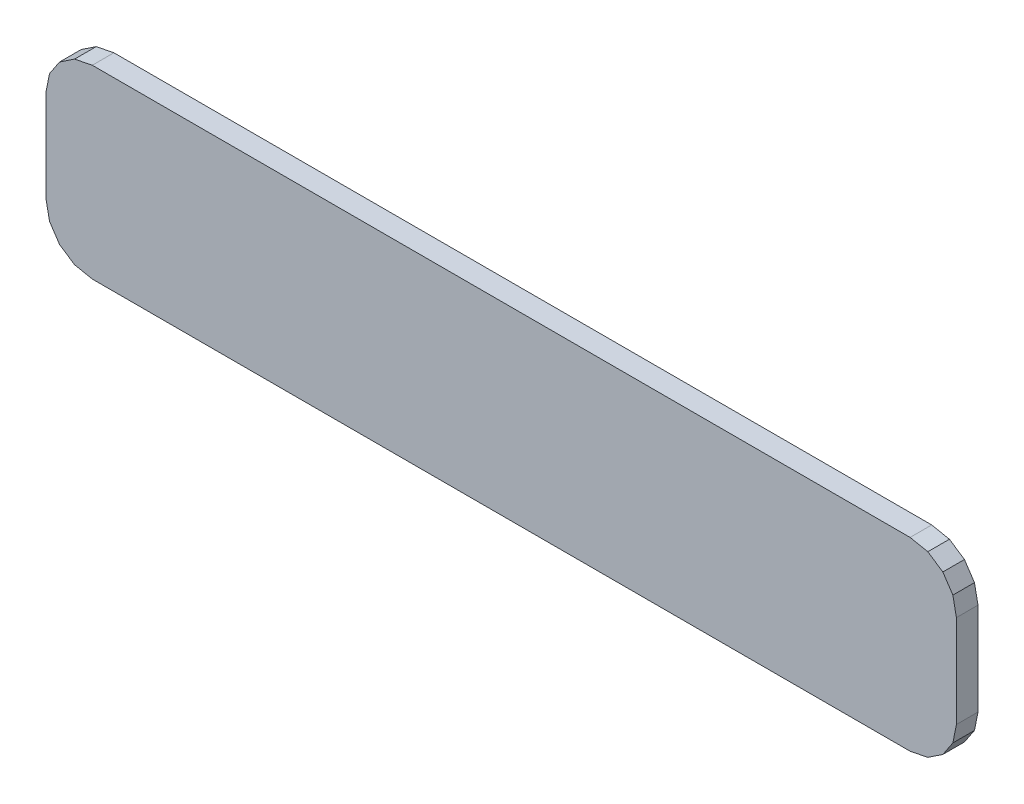
ISO-10303-21;
HEADER;
FILE_DESCRIPTION(('STEP AP214'),'2;1');
FILE_NAME('part.step','',(''),(''),'','','');
FILE_SCHEMA(('AUTOMOTIVE_DESIGN { 1 0 10303 214 1 1 1 1 }'));
ENDSEC;
DATA;
#1=APPLICATION_CONTEXT('core data for automotive mechanical design processes');
#2=APPLICATION_PROTOCOL_DEFINITION('international standard','automotive_design',2000,#1);
#3=PRODUCT_CONTEXT('',#1,'mechanical');
#4=PRODUCT('Part','Part','',(#3));
#5=PRODUCT_RELATED_PRODUCT_CATEGORY('part','',(#4));
#6=PRODUCT_DEFINITION_FORMATION('','',#4);
#7=PRODUCT_DEFINITION_CONTEXT('part definition',#1,'design');
#8=PRODUCT_DEFINITION('design','',#6,#7);
#9=PRODUCT_DEFINITION_SHAPE('','',#8);
#10=(LENGTH_UNIT() NAMED_UNIT(*) SI_UNIT(.MILLI.,.METRE.));
#11=(NAMED_UNIT(*) PLANE_ANGLE_UNIT() SI_UNIT($,.RADIAN.));
#12=(NAMED_UNIT(*) SI_UNIT($,.STERADIAN.) SOLID_ANGLE_UNIT());
#13=UNCERTAINTY_MEASURE_WITH_UNIT(LENGTH_MEASURE(1.E-05),#10,'distance_accuracy_value','');
#14=(GEOMETRIC_REPRESENTATION_CONTEXT(3) GLOBAL_UNCERTAINTY_ASSIGNED_CONTEXT((#13)) GLOBAL_UNIT_ASSIGNED_CONTEXT((#10,
#11,#12)) REPRESENTATION_CONTEXT('',''));
#15=CARTESIAN_POINT('',(0.,0.,0.));
#16=DIRECTION('',(0.,0.,1.));
#17=DIRECTION('',(1.,0.,0.));
#18=AXIS2_PLACEMENT_3D('',#15,#16,#17);
#19=CARTESIAN_POINT('',(131.4125,-68.,1.635));
#20=DIRECTION('',(0.,0.,-1.));
#21=DIRECTION('',(0.,-1.,0.));
#22=AXIS2_PLACEMENT_3D('',#19,#20,#21);
#23=PLANE('',#22);
#24=DIRECTION('',(0.98078517484451,-0.195090852694903,0.));
#25=VECTOR('',#24,1.);
#26=CARTESIAN_POINT('',(132.075,-67.85,1.635));
#27=LINE('',#26,#25);
#28=CARTESIAN_POINT('',(132.075,-67.85,1.635));
#29=VERTEX_POINT('',#28);
#30=CARTESIAN_POINT('',(132.103701,-67.855709,1.635));
#31=VERTEX_POINT('',#30);
#32=EDGE_CURVE('E25',#29,#31,#27,.T.);
#33=ORIENTED_EDGE('',*,*,#32,.F.);
#34=DIRECTION('',(1.,0.,0.));
#35=VECTOR('',#34,1.);
#36=CARTESIAN_POINT('',(130.75,-67.85,1.635));
#37=LINE('',#36,#35);
#38=CARTESIAN_POINT('',(130.75,-67.85,1.635));
#39=VERTEX_POINT('',#38);
#40=EDGE_CURVE('E389',#39,#29,#37,.T.);
#41=ORIENTED_EDGE('',*,*,#40,.F.);
#42=DIRECTION('',(0.98078517484451,0.195090852694903,0.));
#43=VECTOR('',#42,1.);
#44=CARTESIAN_POINT('',(130.721299,-67.855709,1.635));
#45=LINE('',#44,#43);
#46=CARTESIAN_POINT('',(130.721299,-67.855709,1.635));
#47=VERTEX_POINT('',#46);
#48=EDGE_CURVE('E231',#47,#39,#45,.T.);
#49=ORIENTED_EDGE('',*,*,#48,.F.);
#50=DIRECTION('',(0.831471547866119,0.55556733623308,0.));
#51=VECTOR('',#50,1.);
#52=CARTESIAN_POINT('',(130.696967,-67.871967,1.635));
#53=LINE('',#52,#51);
#54=CARTESIAN_POINT('',(130.696967,-67.871967,1.635));
#55=VERTEX_POINT('',#54);
#56=EDGE_CURVE('E277',#55,#47,#53,.T.);
#57=ORIENTED_EDGE('',*,*,#56,.F.);
#58=DIRECTION('',(0.555567336231926,0.83147154786689,0.));
#59=VECTOR('',#58,1.);
#60=CARTESIAN_POINT('',(130.680709,-67.896299,1.635));
#61=LINE('',#60,#59);
#62=CARTESIAN_POINT('',(130.680709,-67.896299,1.635));
#63=VERTEX_POINT('',#62);
#64=EDGE_CURVE('E413',#63,#55,#61,.T.);
#65=ORIENTED_EDGE('',*,*,#64,.F.);
#66=DIRECTION('',(0.19509085269394,0.980785174844701,0.));
#67=VECTOR('',#66,1.);
#68=CARTESIAN_POINT('',(130.675,-67.925,1.635));
#69=LINE('',#68,#67);
#70=CARTESIAN_POINT('',(130.675,-67.925,1.635));
#71=VERTEX_POINT('',#70);
#72=EDGE_CURVE('E401',#71,#63,#69,.T.);
#73=ORIENTED_EDGE('',*,*,#72,.F.);
#74=DIRECTION('',(0.,1.,0.));
#75=VECTOR('',#74,1.);
#76=CARTESIAN_POINT('',(130.675,-68.075,1.635));
#77=LINE('',#76,#75);
#78=CARTESIAN_POINT('',(130.675,-68.075,1.635));
#79=VERTEX_POINT('',#78);
#80=EDGE_CURVE('E309',#79,#71,#77,.T.);
#81=ORIENTED_EDGE('',*,*,#80,.F.);
#82=DIRECTION('',(-0.19509085269394,0.980785174844701,0.));
#83=VECTOR('',#82,1.);
#84=CARTESIAN_POINT('',(130.680709,-68.103701,1.635));
#85=LINE('',#84,#83);
#86=CARTESIAN_POINT('',(130.680709,-68.103701,1.635));
#87=VERTEX_POINT('',#86);
#88=EDGE_CURVE('E257',#87,#79,#85,.T.);
#89=ORIENTED_EDGE('',*,*,#88,.F.);
#90=DIRECTION('',(-0.555567336231926,0.83147154786689,0.));
#91=VECTOR('',#90,1.);
#92=CARTESIAN_POINT('',(130.696967,-68.128033,1.635));
#93=LINE('',#92,#91);
#94=CARTESIAN_POINT('',(130.696967,-68.128033,1.635));
#95=VERTEX_POINT('',#94);
#96=EDGE_CURVE('E326',#95,#87,#93,.T.);
#97=ORIENTED_EDGE('',*,*,#96,.F.);
#98=DIRECTION('',(-0.831471547866119,0.55556733623308,0.));
#99=VECTOR('',#98,1.);
#100=CARTESIAN_POINT('',(130.721299,-68.144291,1.635));
#101=LINE('',#100,#99);
#102=CARTESIAN_POINT('',(130.721299,-68.144291,1.635));
#103=VERTEX_POINT('',#102);
#104=EDGE_CURVE('E361',#103,#95,#101,.T.);
#105=ORIENTED_EDGE('',*,*,#104,.F.);
#106=DIRECTION('',(-0.98078517484451,0.195090852694903,0.));
#107=VECTOR('',#106,1.);
#108=CARTESIAN_POINT('',(130.75,-68.15,1.635));
#109=LINE('',#108,#107);
#110=CARTESIAN_POINT('',(130.75,-68.15,1.635));
#111=VERTEX_POINT('',#110);
#112=EDGE_CURVE('E349',#111,#103,#109,.T.);
#113=ORIENTED_EDGE('',*,*,#112,.F.);
#114=DIRECTION('',(-1.,0.,0.));
#115=VECTOR('',#114,1.);
#116=CARTESIAN_POINT('',(132.075,-68.15,1.635));
#117=LINE('',#116,#115);
#118=CARTESIAN_POINT('',(132.075,-68.15,1.635));
#119=VERTEX_POINT('',#118);
#120=EDGE_CURVE('E296',#119,#111,#117,.T.);
#121=ORIENTED_EDGE('',*,*,#120,.F.);
#122=DIRECTION('',(-0.98078517484451,-0.195090852694903,0.));
#123=VECTOR('',#122,1.);
#124=CARTESIAN_POINT('',(132.103701,-68.144291,1.635));
#125=LINE('',#124,#123);
#126=CARTESIAN_POINT('',(132.103701,-68.144291,1.635));
#127=VERTEX_POINT('',#126);
#128=EDGE_CURVE('E331',#127,#119,#125,.T.);
#129=ORIENTED_EDGE('',*,*,#128,.F.);
#130=DIRECTION('',(-0.831471547866119,-0.55556733623308,0.));
#131=VECTOR('',#130,1.);
#132=CARTESIAN_POINT('',(132.128033,-68.128033,1.635));
#133=LINE('',#132,#131);
#134=CARTESIAN_POINT('',(132.128033,-68.128033,1.635));
#135=VERTEX_POINT('',#134);
#136=EDGE_CURVE('E313',#135,#127,#133,.T.);
#137=ORIENTED_EDGE('',*,*,#136,.F.);
#138=DIRECTION('',(-0.55556733623308,-0.831471547866119,0.));
#139=VECTOR('',#138,1.);
#140=CARTESIAN_POINT('',(132.144291,-68.103701,1.635));
#141=LINE('',#140,#139);
#142=CARTESIAN_POINT('',(132.144291,-68.103701,1.635));
#143=VERTEX_POINT('',#142);
#144=EDGE_CURVE('E237',#143,#135,#141,.T.);
#145=ORIENTED_EDGE('',*,*,#144,.F.);
#146=DIRECTION('',(-0.19509085269394,-0.980785174844701,0.));
#147=VECTOR('',#146,1.);
#148=CARTESIAN_POINT('',(132.15,-68.075,1.635));
#149=LINE('',#148,#147);
#150=CARTESIAN_POINT('',(132.15,-68.075,1.635));
#151=VERTEX_POINT('',#150);
#152=EDGE_CURVE('E238',#151,#143,#149,.T.);
#153=ORIENTED_EDGE('',*,*,#152,.F.);
#154=DIRECTION('',(0.,-1.,0.));
#155=VECTOR('',#154,1.);
#156=CARTESIAN_POINT('',(132.15,-67.925,1.635));
#157=LINE('',#156,#155);
#158=CARTESIAN_POINT('',(132.15,-67.925,1.635));
#159=VERTEX_POINT('',#158);
#160=EDGE_CURVE('E252',#159,#151,#157,.T.);
#161=ORIENTED_EDGE('',*,*,#160,.F.);
#162=DIRECTION('',(0.19509085269394,-0.980785174844701,0.));
#163=VECTOR('',#162,1.);
#164=CARTESIAN_POINT('',(132.144291,-67.896299,1.635));
#165=LINE('',#164,#163);
#166=CARTESIAN_POINT('',(132.144291,-67.896299,1.635));
#167=VERTEX_POINT('',#166);
#168=EDGE_CURVE('E266',#167,#159,#165,.T.);
#169=ORIENTED_EDGE('',*,*,#168,.F.);
#170=DIRECTION('',(0.55556733623308,-0.831471547866119,0.));
#171=VECTOR('',#170,1.);
#172=CARTESIAN_POINT('',(132.128033,-67.871967,1.635));
#173=LINE('',#172,#171);
#174=CARTESIAN_POINT('',(132.128033,-67.871967,1.635));
#175=VERTEX_POINT('',#174);
#176=EDGE_CURVE('E206',#175,#167,#173,.T.);
#177=ORIENTED_EDGE('',*,*,#176,.F.);
#178=DIRECTION('',(0.831471547866119,-0.55556733623308,0.));
#179=VECTOR('',#178,1.);
#180=CARTESIAN_POINT('',(132.103701,-67.855709,1.635));
#181=LINE('',#180,#179);
#182=EDGE_CURVE('E204',#31,#175,#181,.T.);
#183=ORIENTED_EDGE('',*,*,#182,.F.);
#184=EDGE_LOOP('',(#33,#41,#49,#57,#65,#73,#81,#89,#97,#105,#113,#121,#129,#137,#145,#153,#161,
#169,#177,#183));
#185=FACE_BOUND('',#184,.T.);
#186=ADVANCED_FACE('F17',(#185),#23,.F.);
#187=CARTESIAN_POINT('',(131.4125,-68.,1.6));
#188=DIRECTION('',(0.,0.,-1.));
#189=DIRECTION('',(0.,-1.,0.));
#190=AXIS2_PLACEMENT_3D('',#187,#188,#189);
#191=PLANE('',#190);
#192=DIRECTION('',(0.831471547866119,-0.55556733623308,0.));
#193=VECTOR('',#192,1.);
#194=CARTESIAN_POINT('',(132.103701,-67.855709,1.6));
#195=LINE('',#194,#193);
#196=CARTESIAN_POINT('',(132.103701,-67.855709,1.6));
#197=VERTEX_POINT('',#196);
#198=CARTESIAN_POINT('',(132.128033,-67.871967,1.6));
#199=VERTEX_POINT('',#198);
#200=EDGE_CURVE('E216',#197,#199,#195,.T.);
#201=ORIENTED_EDGE('',*,*,#200,.T.);
#202=DIRECTION('',(0.55556733623308,-0.831471547866119,0.));
#203=VECTOR('',#202,1.);
#204=CARTESIAN_POINT('',(132.128033,-67.871967,1.6));
#205=LINE('',#204,#203);
#206=CARTESIAN_POINT('',(132.144291,-67.896299,1.6));
#207=VERTEX_POINT('',#206);
#208=EDGE_CURVE('E224',#199,#207,#205,.T.);
#209=ORIENTED_EDGE('',*,*,#208,.T.);
#210=DIRECTION('',(0.19509085269394,-0.980785174844701,0.));
#211=VECTOR('',#210,1.);
#212=CARTESIAN_POINT('',(132.144291,-67.896299,1.6));
#213=LINE('',#212,#211);
#214=CARTESIAN_POINT('',(132.15,-67.925,1.6));
#215=VERTEX_POINT('',#214);
#216=EDGE_CURVE('E248',#207,#215,#213,.T.);
#217=ORIENTED_EDGE('',*,*,#216,.T.);
#218=DIRECTION('',(0.,-1.,0.));
#219=VECTOR('',#218,1.);
#220=CARTESIAN_POINT('',(132.15,-67.925,1.6));
#221=LINE('',#220,#219);
#222=CARTESIAN_POINT('',(132.15,-68.075,1.6));
#223=VERTEX_POINT('',#222);
#224=EDGE_CURVE('E242',#215,#223,#221,.T.);
#225=ORIENTED_EDGE('',*,*,#224,.T.);
#226=DIRECTION('',(-0.19509085269394,-0.980785174844701,0.));
#227=VECTOR('',#226,1.);
#228=CARTESIAN_POINT('',(132.15,-68.075,1.6));
#229=LINE('',#228,#227);
#230=CARTESIAN_POINT('',(132.144291,-68.103701,1.6));
#231=VERTEX_POINT('',#230);
#232=EDGE_CURVE('E300',#223,#231,#229,.T.);
#233=ORIENTED_EDGE('',*,*,#232,.T.);
#234=DIRECTION('',(-0.55556733623308,-0.831471547866119,0.));
#235=VECTOR('',#234,1.);
#236=CARTESIAN_POINT('',(132.144291,-68.103701,1.6));
#237=LINE('',#236,#235);
#238=CARTESIAN_POINT('',(132.128033,-68.128033,1.6));
#239=VERTEX_POINT('',#238);
#240=EDGE_CURVE('E236',#231,#239,#237,.T.);
#241=ORIENTED_EDGE('',*,*,#240,.T.);
#242=DIRECTION('',(-0.831471547866119,-0.55556733623308,0.));
#243=VECTOR('',#242,1.);
#244=CARTESIAN_POINT('',(132.128033,-68.128033,1.6));
#245=LINE('',#244,#243);
#246=CARTESIAN_POINT('',(132.103701,-68.144291,1.6));
#247=VERTEX_POINT('',#246);
#248=EDGE_CURVE('E321',#239,#247,#245,.T.);
#249=ORIENTED_EDGE('',*,*,#248,.T.);
#250=DIRECTION('',(-0.98078517484451,-0.195090852694903,0.));
#251=VECTOR('',#250,1.);
#252=CARTESIAN_POINT('',(132.103701,-68.144291,1.6));
#253=LINE('',#252,#251);
#254=CARTESIAN_POINT('',(132.075,-68.15,1.6));
#255=VERTEX_POINT('',#254);
#256=EDGE_CURVE('E339',#247,#255,#253,.T.);
#257=ORIENTED_EDGE('',*,*,#256,.T.);
#258=DIRECTION('',(-1.,0.,0.));
#259=VECTOR('',#258,1.);
#260=CARTESIAN_POINT('',(132.075,-68.15,1.6));
#261=LINE('',#260,#259);
#262=CARTESIAN_POINT('',(130.75,-68.15,1.6));
#263=VERTEX_POINT('',#262);
#264=EDGE_CURVE('E295',#255,#263,#261,.T.);
#265=ORIENTED_EDGE('',*,*,#264,.T.);
#266=DIRECTION('',(-0.98078517484451,0.195090852694903,0.));
#267=VECTOR('',#266,1.);
#268=CARTESIAN_POINT('',(130.75,-68.15,1.6));
#269=LINE('',#268,#267);
#270=CARTESIAN_POINT('',(130.721299,-68.144291,1.6));
#271=VERTEX_POINT('',#270);
#272=EDGE_CURVE('E357',#263,#271,#269,.T.);
#273=ORIENTED_EDGE('',*,*,#272,.T.);
#274=DIRECTION('',(-0.831471547866119,0.55556733623308,0.));
#275=VECTOR('',#274,1.);
#276=CARTESIAN_POINT('',(130.721299,-68.144291,1.6));
#277=LINE('',#276,#275);
#278=CARTESIAN_POINT('',(130.696967,-68.128033,1.6));
#279=VERTEX_POINT('',#278);
#280=EDGE_CURVE('E322',#271,#279,#277,.T.);
#281=ORIENTED_EDGE('',*,*,#280,.T.);
#282=DIRECTION('',(-0.555567336231926,0.83147154786689,0.));
#283=VECTOR('',#282,1.);
#284=CARTESIAN_POINT('',(130.696967,-68.128033,1.6));
#285=LINE('',#284,#283);
#286=CARTESIAN_POINT('',(130.680709,-68.103701,1.6));
#287=VERTEX_POINT('',#286);
#288=EDGE_CURVE('E262',#279,#287,#285,.T.);
#289=ORIENTED_EDGE('',*,*,#288,.T.);
#290=DIRECTION('',(-0.19509085269394,0.980785174844701,0.));
#291=VECTOR('',#290,1.);
#292=CARTESIAN_POINT('',(130.680709,-68.103701,1.6));
#293=LINE('',#292,#291);
#294=CARTESIAN_POINT('',(130.675,-68.075,1.6));
#295=VERTEX_POINT('',#294);
#296=EDGE_CURVE('E385',#287,#295,#293,.T.);
#297=ORIENTED_EDGE('',*,*,#296,.T.);
#298=DIRECTION('',(0.,1.,0.));
#299=VECTOR('',#298,1.);
#300=CARTESIAN_POINT('',(130.675,-68.075,1.6));
#301=LINE('',#300,#299);
#302=CARTESIAN_POINT('',(130.675,-67.925,1.6));
#303=VERTEX_POINT('',#302);
#304=EDGE_CURVE('E308',#295,#303,#301,.T.);
#305=ORIENTED_EDGE('',*,*,#304,.T.);
#306=DIRECTION('',(0.19509085269394,0.980785174844701,0.));
#307=VECTOR('',#306,1.);
#308=CARTESIAN_POINT('',(130.675,-67.925,1.6));
#309=LINE('',#308,#307);
#310=CARTESIAN_POINT('',(130.680709,-67.896299,1.6));
#311=VERTEX_POINT('',#310);
#312=EDGE_CURVE('E409',#303,#311,#309,.T.);
#313=ORIENTED_EDGE('',*,*,#312,.T.);
#314=DIRECTION('',(0.555567336231926,0.83147154786689,0.));
#315=VECTOR('',#314,1.);
#316=CARTESIAN_POINT('',(130.680709,-67.896299,1.6));
#317=LINE('',#316,#315);
#318=CARTESIAN_POINT('',(130.696967,-67.871967,1.6));
#319=VERTEX_POINT('',#318);
#320=EDGE_CURVE('E368',#311,#319,#317,.T.);
#321=ORIENTED_EDGE('',*,*,#320,.T.);
#322=DIRECTION('',(0.831471547866119,0.55556733623308,0.));
#323=VECTOR('',#322,1.);
#324=CARTESIAN_POINT('',(130.696967,-67.871967,1.6));
#325=LINE('',#324,#323);
#326=CARTESIAN_POINT('',(130.721299,-67.855709,1.6));
#327=VERTEX_POINT('',#326);
#328=EDGE_CURVE('E276',#319,#327,#325,.T.);
#329=ORIENTED_EDGE('',*,*,#328,.T.);
#330=DIRECTION('',(0.98078517484451,0.195090852694903,0.));
#331=VECTOR('',#330,1.);
#332=CARTESIAN_POINT('',(130.721299,-67.855709,1.6));
#333=LINE('',#332,#331);
#334=CARTESIAN_POINT('',(130.75,-67.85,1.6));
#335=VERTEX_POINT('',#334);
#336=EDGE_CURVE('E230',#327,#335,#333,.T.);
#337=ORIENTED_EDGE('',*,*,#336,.T.);
#338=DIRECTION('',(1.,0.,0.));
#339=VECTOR('',#338,1.);
#340=CARTESIAN_POINT('',(130.75,-67.85,1.6));
#341=LINE('',#340,#339);
#342=CARTESIAN_POINT('',(132.075,-67.85,1.6));
#343=VERTEX_POINT('',#342);
#344=EDGE_CURVE('E201',#335,#343,#341,.T.);
#345=ORIENTED_EDGE('',*,*,#344,.T.);
#346=DIRECTION('',(0.98078517484451,-0.195090852694903,0.));
#347=VECTOR('',#346,1.);
#348=CARTESIAN_POINT('',(132.075,-67.85,1.6));
#349=LINE('',#348,#347);
#350=EDGE_CURVE('E11',#343,#197,#349,.T.);
#351=ORIENTED_EDGE('',*,*,#350,.T.);
#352=EDGE_LOOP('',(#201,#209,#217,#225,#233,#241,#249,#257,#265,#273,#281,#289,#297,#305,#313,
#321,#329,#337,#345,#351));
#353=FACE_BOUND('',#352,.T.);
#354=ADVANCED_FACE('F612',(#353),#191,.T.);
#355=CARTESIAN_POINT('',(132.075,-67.85,1.6));
#356=DIRECTION('',(0.195090852694903,0.98078517484451,0.));
#357=DIRECTION('',(0.,0.,-1.));
#358=AXIS2_PLACEMENT_3D('',#355,#356,#357);
#359=PLANE('',#358);
#360=DIRECTION('',(0.,0.,1.));
#361=VECTOR('',#360,1.);
#362=CARTESIAN_POINT('',(132.075,-67.85,1.6));
#363=LINE('',#362,#361);
#364=EDGE_CURVE('E198',#343,#29,#363,.T.);
#365=ORIENTED_EDGE('',*,*,#364,.T.);
#366=ORIENTED_EDGE('',*,*,#32,.T.);
#367=DIRECTION('',(0.,0.,1.));
#368=VECTOR('',#367,1.);
#369=CARTESIAN_POINT('',(132.103701,-67.855709,1.6));
#370=LINE('',#369,#368);
#371=EDGE_CURVE('E196',#197,#31,#370,.T.);
#372=ORIENTED_EDGE('',*,*,#371,.F.);
#373=ORIENTED_EDGE('',*,*,#350,.F.);
#374=EDGE_LOOP('',(#365,#366,#372,#373));
#375=FACE_BOUND('',#374,.T.);
#376=ADVANCED_FACE('F194',(#375),#359,.T.);
#377=CARTESIAN_POINT('',(130.75,-67.85,1.6));
#378=DIRECTION('',(0.,1.,0.));
#379=DIRECTION('',(1.,0.,0.));
#380=AXIS2_PLACEMENT_3D('',#377,#378,#379);
#381=PLANE('',#380);
#382=DIRECTION('',(0.,0.,1.));
#383=VECTOR('',#382,1.);
#384=CARTESIAN_POINT('',(130.75,-67.85,1.6));
#385=LINE('',#384,#383);
#386=EDGE_CURVE('E226',#335,#39,#385,.T.);
#387=ORIENTED_EDGE('',*,*,#386,.T.);
#388=ORIENTED_EDGE('',*,*,#40,.T.);
#389=ORIENTED_EDGE('',*,*,#364,.F.);
#390=ORIENTED_EDGE('',*,*,#344,.F.);
#391=EDGE_LOOP('',(#387,#388,#389,#390));
#392=FACE_BOUND('',#391,.T.);
#393=ADVANCED_FACE('F664',(#392),#381,.T.);
#394=CARTESIAN_POINT('',(130.721299,-67.855709,1.6));
#395=DIRECTION('',(-0.195090852694903,0.98078517484451,0.));
#396=DIRECTION('',(0.,0.,1.));
#397=AXIS2_PLACEMENT_3D('',#394,#395,#396);
#398=PLANE('',#397);
#399=DIRECTION('',(0.,0.,1.));
#400=VECTOR('',#399,1.);
#401=CARTESIAN_POINT('',(130.721299,-67.855709,1.6));
#402=LINE('',#401,#400);
#403=EDGE_CURVE('E272',#327,#47,#402,.T.);
#404=ORIENTED_EDGE('',*,*,#403,.T.);
#405=ORIENTED_EDGE('',*,*,#48,.T.);
#406=ORIENTED_EDGE('',*,*,#386,.F.);
#407=ORIENTED_EDGE('',*,*,#336,.F.);
#408=EDGE_LOOP('',(#404,#405,#406,#407));
#409=FACE_BOUND('',#408,.T.);
#410=ADVANCED_FACE('F662',(#409),#398,.T.);
#411=CARTESIAN_POINT('',(130.696967,-67.871967,1.6));
#412=DIRECTION('',(-0.55556733623308,0.831471547866119,0.));
#413=DIRECTION('',(0.,0.,1.));
#414=AXIS2_PLACEMENT_3D('',#411,#412,#413);
#415=PLANE('',#414);
#416=DIRECTION('',(0.,0.,1.));
#417=VECTOR('',#416,1.);
#418=CARTESIAN_POINT('',(130.696967,-67.871967,1.6));
#419=LINE('',#418,#417);
#420=EDGE_CURVE('E417',#319,#55,#419,.T.);
#421=ORIENTED_EDGE('',*,*,#420,.T.);
#422=ORIENTED_EDGE('',*,*,#56,.T.);
#423=ORIENTED_EDGE('',*,*,#403,.F.);
#424=ORIENTED_EDGE('',*,*,#328,.F.);
#425=EDGE_LOOP('',(#421,#422,#423,#424));
#426=FACE_BOUND('',#425,.T.);
#427=ADVANCED_FACE('F660',(#426),#415,.T.);
#428=CARTESIAN_POINT('',(130.680709,-67.896299,1.6));
#429=DIRECTION('',(-0.83147154786689,0.555567336231926,0.));
#430=DIRECTION('',(0.,0.,1.));
#431=AXIS2_PLACEMENT_3D('',#428,#429,#430);
#432=PLANE('',#431);
#433=DIRECTION('',(0.,0.,1.));
#434=VECTOR('',#433,1.);
#435=CARTESIAN_POINT('',(130.680709,-67.896299,1.6));
#436=LINE('',#435,#434);
#437=EDGE_CURVE('E405',#311,#63,#436,.T.);
#438=ORIENTED_EDGE('',*,*,#437,.T.);
#439=ORIENTED_EDGE('',*,*,#64,.T.);
#440=ORIENTED_EDGE('',*,*,#420,.F.);
#441=ORIENTED_EDGE('',*,*,#320,.F.);
#442=EDGE_LOOP('',(#438,#439,#440,#441));
#443=FACE_BOUND('',#442,.T.);
#444=ADVANCED_FACE('F655',(#443),#432,.T.);
#445=CARTESIAN_POINT('',(130.675,-67.925,1.6));
#446=DIRECTION('',(-0.980785174844701,0.19509085269394,0.));
#447=DIRECTION('',(0.,0.,1.));
#448=AXIS2_PLACEMENT_3D('',#445,#446,#447);
#449=PLANE('',#448);
#450=DIRECTION('',(0.,0.,1.));
#451=VECTOR('',#450,1.);
#452=CARTESIAN_POINT('',(130.675,-67.925,1.6));
#453=LINE('',#452,#451);
#454=EDGE_CURVE('E304',#303,#71,#453,.T.);
#455=ORIENTED_EDGE('',*,*,#454,.T.);
#456=ORIENTED_EDGE('',*,*,#72,.T.);
#457=ORIENTED_EDGE('',*,*,#437,.F.);
#458=ORIENTED_EDGE('',*,*,#312,.F.);
#459=EDGE_LOOP('',(#455,#456,#457,#458));
#460=FACE_BOUND('',#459,.T.);
#461=ADVANCED_FACE('F653',(#460),#449,.T.);
#462=CARTESIAN_POINT('',(130.675,-68.075,1.6));
#463=DIRECTION('',(-1.,0.,0.));
#464=DIRECTION('',(0.,0.,1.));
#465=AXIS2_PLACEMENT_3D('',#462,#463,#464);
#466=PLANE('',#465);
#467=DIRECTION('',(0.,0.,1.));
#468=VECTOR('',#467,1.);
#469=CARTESIAN_POINT('',(130.675,-68.075,1.6));
#470=LINE('',#469,#468);
#471=EDGE_CURVE('E261',#295,#79,#470,.T.);
#472=ORIENTED_EDGE('',*,*,#471,.T.);
#473=ORIENTED_EDGE('',*,*,#80,.T.);
#474=ORIENTED_EDGE('',*,*,#454,.F.);
#475=ORIENTED_EDGE('',*,*,#304,.F.);
#476=EDGE_LOOP('',(#472,#473,#474,#475));
#477=FACE_BOUND('',#476,.T.);
#478=ADVANCED_FACE('F651',(#477),#466,.T.);
#479=CARTESIAN_POINT('',(130.680709,-68.103701,1.6));
#480=DIRECTION('',(-0.980785174844701,-0.19509085269394,0.));
#481=DIRECTION('',(-0.19509085269394,0.980785174844701,0.));
#482=AXIS2_PLACEMENT_3D('',#479,#480,#481);
#483=PLANE('',#482);
#484=DIRECTION('',(0.,0.,1.));
#485=VECTOR('',#484,1.);
#486=CARTESIAN_POINT('',(130.680709,-68.103701,1.6));
#487=LINE('',#486,#485);
#488=EDGE_CURVE('E375',#287,#87,#487,.T.);
#489=ORIENTED_EDGE('',*,*,#488,.T.);
#490=ORIENTED_EDGE('',*,*,#88,.T.);
#491=ORIENTED_EDGE('',*,*,#471,.F.);
#492=ORIENTED_EDGE('',*,*,#296,.F.);
#493=EDGE_LOOP('',(#489,#490,#491,#492));
#494=FACE_BOUND('',#493,.T.);
#495=ADVANCED_FACE('F646',(#494),#483,.T.);
#496=CARTESIAN_POINT('',(130.696967,-68.128033,1.6));
#497=DIRECTION('',(-0.83147154786689,-0.555567336231926,0.));
#498=DIRECTION('',(-0.555567336231926,0.83147154786689,0.));
#499=AXIS2_PLACEMENT_3D('',#496,#497,#498);
#500=PLANE('',#499);
#501=DIRECTION('',(0.,0.,1.));
#502=VECTOR('',#501,1.);
#503=CARTESIAN_POINT('',(130.696967,-68.128033,1.6));
#504=LINE('',#503,#502);
#505=EDGE_CURVE('E327',#279,#95,#504,.T.);
#506=ORIENTED_EDGE('',*,*,#505,.T.);
#507=ORIENTED_EDGE('',*,*,#96,.T.);
#508=ORIENTED_EDGE('',*,*,#488,.F.);
#509=ORIENTED_EDGE('',*,*,#288,.F.);
#510=EDGE_LOOP('',(#506,#507,#508,#509));
#511=FACE_BOUND('',#510,.T.);
#512=ADVANCED_FACE('F644',(#511),#500,.T.);
#513=CARTESIAN_POINT('',(130.721299,-68.144291,1.6));
#514=DIRECTION('',(-0.55556733623308,-0.831471547866119,0.));
#515=DIRECTION('',(-0.831471547866119,0.55556733623308,0.));
#516=AXIS2_PLACEMENT_3D('',#513,#514,#515);
#517=PLANE('',#516);
#518=DIRECTION('',(0.,0.,1.));
#519=VECTOR('',#518,1.);
#520=CARTESIAN_POINT('',(130.721299,-68.144291,1.6));
#521=LINE('',#520,#519);
#522=EDGE_CURVE('E353',#271,#103,#521,.T.);
#523=ORIENTED_EDGE('',*,*,#522,.T.);
#524=ORIENTED_EDGE('',*,*,#104,.T.);
#525=ORIENTED_EDGE('',*,*,#505,.F.);
#526=ORIENTED_EDGE('',*,*,#280,.F.);
#527=EDGE_LOOP('',(#523,#524,#525,#526));
#528=FACE_BOUND('',#527,.T.);
#529=ADVANCED_FACE('F642',(#528),#517,.T.);
#530=CARTESIAN_POINT('',(130.75,-68.15,1.6));
#531=DIRECTION('',(-0.195090852694903,-0.98078517484451,0.));
#532=DIRECTION('',(-0.98078517484451,0.195090852694903,0.));
#533=AXIS2_PLACEMENT_3D('',#530,#531,#532);
#534=PLANE('',#533);
#535=DIRECTION('',(0.,0.,1.));
#536=VECTOR('',#535,1.);
#537=CARTESIAN_POINT('',(130.75,-68.15,1.6));
#538=LINE('',#537,#536);
#539=EDGE_CURVE('E291',#263,#111,#538,.T.);
#540=ORIENTED_EDGE('',*,*,#539,.T.);
#541=ORIENTED_EDGE('',*,*,#112,.T.);
#542=ORIENTED_EDGE('',*,*,#522,.F.);
#543=ORIENTED_EDGE('',*,*,#272,.F.);
#544=EDGE_LOOP('',(#540,#541,#542,#543));
#545=FACE_BOUND('',#544,.T.);
#546=ADVANCED_FACE('F637',(#545),#534,.T.);
#547=CARTESIAN_POINT('',(132.075,-68.15,1.6));
#548=DIRECTION('',(0.,-1.,0.));
#549=DIRECTION('',(0.,0.,-1.));
#550=AXIS2_PLACEMENT_3D('',#547,#548,#549);
#551=PLANE('',#550);
#552=DIRECTION('',(0.,0.,1.));
#553=VECTOR('',#552,1.);
#554=CARTESIAN_POINT('',(132.075,-68.15,1.6));
#555=LINE('',#554,#553);
#556=EDGE_CURVE('E335',#255,#119,#555,.T.);
#557=ORIENTED_EDGE('',*,*,#556,.T.);
#558=ORIENTED_EDGE('',*,*,#120,.T.);
#559=ORIENTED_EDGE('',*,*,#539,.F.);
#560=ORIENTED_EDGE('',*,*,#264,.F.);
#561=EDGE_LOOP('',(#557,#558,#559,#560));
#562=FACE_BOUND('',#561,.T.);
#563=ADVANCED_FACE('F635',(#562),#551,.T.);
#564=CARTESIAN_POINT('',(132.103701,-68.144291,1.6));
#565=DIRECTION('',(0.195090852694903,-0.98078517484451,0.));
#566=DIRECTION('',(0.,0.,-1.));
#567=AXIS2_PLACEMENT_3D('',#564,#565,#566);
#568=PLANE('',#567);
#569=DIRECTION('',(0.,0.,1.));
#570=VECTOR('',#569,1.);
#571=CARTESIAN_POINT('',(132.103701,-68.144291,1.6));
#572=LINE('',#571,#570);
#573=EDGE_CURVE('E317',#247,#127,#572,.T.);
#574=ORIENTED_EDGE('',*,*,#573,.T.);
#575=ORIENTED_EDGE('',*,*,#128,.T.);
#576=ORIENTED_EDGE('',*,*,#556,.F.);
#577=ORIENTED_EDGE('',*,*,#256,.F.);
#578=EDGE_LOOP('',(#574,#575,#576,#577));
#579=FACE_BOUND('',#578,.T.);
#580=ADVANCED_FACE('F633',(#579),#568,.T.);
#581=CARTESIAN_POINT('',(132.128033,-68.128033,1.6));
#582=DIRECTION('',(0.55556733623308,-0.831471547866119,0.));
#583=DIRECTION('',(0.,0.,-1.));
#584=AXIS2_PLACEMENT_3D('',#581,#582,#583);
#585=PLANE('',#584);
#586=DIRECTION('',(0.,0.,1.));
#587=VECTOR('',#586,1.);
#588=CARTESIAN_POINT('',(132.128033,-68.128033,1.6));
#589=LINE('',#588,#587);
#590=EDGE_CURVE('E232',#239,#135,#589,.T.);
#591=ORIENTED_EDGE('',*,*,#590,.T.);
#592=ORIENTED_EDGE('',*,*,#136,.T.);
#593=ORIENTED_EDGE('',*,*,#573,.F.);
#594=ORIENTED_EDGE('',*,*,#248,.F.);
#595=EDGE_LOOP('',(#591,#592,#593,#594));
#596=FACE_BOUND('',#595,.T.);
#597=ADVANCED_FACE('F628',(#596),#585,.T.);
#598=CARTESIAN_POINT('',(132.144291,-68.103701,1.6));
#599=DIRECTION('',(0.831471547866119,-0.55556733623308,0.));
#600=DIRECTION('',(0.,0.,-1.));
#601=AXIS2_PLACEMENT_3D('',#598,#599,#600);
#602=PLANE('',#601);
#603=DIRECTION('',(0.,0.,1.));
#604=VECTOR('',#603,1.);
#605=CARTESIAN_POINT('',(132.144291,-68.103701,1.6));
#606=LINE('',#605,#604);
#607=EDGE_CURVE('E241',#231,#143,#606,.T.);
#608=ORIENTED_EDGE('',*,*,#607,.T.);
#609=ORIENTED_EDGE('',*,*,#144,.T.);
#610=ORIENTED_EDGE('',*,*,#590,.F.);
#611=ORIENTED_EDGE('',*,*,#240,.F.);
#612=EDGE_LOOP('',(#608,#609,#610,#611));
#613=FACE_BOUND('',#612,.T.);
#614=ADVANCED_FACE('F626',(#613),#602,.T.);
#615=CARTESIAN_POINT('',(132.15,-68.075,1.6));
#616=DIRECTION('',(0.980785174844701,-0.19509085269394,0.));
#617=DIRECTION('',(0.,0.,-1.));
#618=AXIS2_PLACEMENT_3D('',#615,#616,#617);
#619=PLANE('',#618);
#620=DIRECTION('',(0.,0.,1.));
#621=VECTOR('',#620,1.);
#622=CARTESIAN_POINT('',(132.15,-68.075,1.6));
#623=LINE('',#622,#621);
#624=EDGE_CURVE('E281',#223,#151,#623,.T.);
#625=ORIENTED_EDGE('',*,*,#624,.T.);
#626=ORIENTED_EDGE('',*,*,#152,.T.);
#627=ORIENTED_EDGE('',*,*,#607,.F.);
#628=ORIENTED_EDGE('',*,*,#232,.F.);
#629=EDGE_LOOP('',(#625,#626,#627,#628));
#630=FACE_BOUND('',#629,.T.);
#631=ADVANCED_FACE('F624',(#630),#619,.T.);
#632=CARTESIAN_POINT('',(132.15,-67.925,1.6));
#633=DIRECTION('',(1.,0.,0.));
#634=DIRECTION('',(0.,1.,0.));
#635=AXIS2_PLACEMENT_3D('',#632,#633,#634);
#636=PLANE('',#635);
#637=DIRECTION('',(0.,0.,1.));
#638=VECTOR('',#637,1.);
#639=CARTESIAN_POINT('',(132.15,-67.925,1.6));
#640=LINE('',#639,#638);
#641=EDGE_CURVE('E253',#215,#159,#640,.T.);
#642=ORIENTED_EDGE('',*,*,#641,.T.);
#643=ORIENTED_EDGE('',*,*,#160,.T.);
#644=ORIENTED_EDGE('',*,*,#624,.F.);
#645=ORIENTED_EDGE('',*,*,#224,.F.);
#646=EDGE_LOOP('',(#642,#643,#644,#645));
#647=FACE_BOUND('',#646,.T.);
#648=ADVANCED_FACE('F619',(#647),#636,.T.);
#649=CARTESIAN_POINT('',(132.144291,-67.896299,1.6));
#650=DIRECTION('',(0.980785174844701,0.19509085269394,0.));
#651=DIRECTION('',(0.,0.,-1.));
#652=AXIS2_PLACEMENT_3D('',#649,#650,#651);
#653=PLANE('',#652);
#654=DIRECTION('',(0.,0.,1.));
#655=VECTOR('',#654,1.);
#656=CARTESIAN_POINT('',(132.144291,-67.896299,1.6));
#657=LINE('',#656,#655);
#658=EDGE_CURVE('E256',#207,#167,#657,.T.);
#659=ORIENTED_EDGE('',*,*,#658,.T.);
#660=ORIENTED_EDGE('',*,*,#168,.T.);
#661=ORIENTED_EDGE('',*,*,#641,.F.);
#662=ORIENTED_EDGE('',*,*,#216,.F.);
#663=EDGE_LOOP('',(#659,#660,#661,#662));
#664=FACE_BOUND('',#663,.T.);
#665=ADVANCED_FACE('F617',(#664),#653,.T.);
#666=CARTESIAN_POINT('',(132.128033,-67.871967,1.6));
#667=DIRECTION('',(0.831471547866119,0.55556733623308,0.));
#668=DIRECTION('',(0.,0.,-1.));
#669=AXIS2_PLACEMENT_3D('',#666,#667,#668);
#670=PLANE('',#669);
#671=DIRECTION('',(0.,0.,1.));
#672=VECTOR('',#671,1.);
#673=CARTESIAN_POINT('',(132.128033,-67.871967,1.6));
#674=LINE('',#673,#672);
#675=EDGE_CURVE('E211',#199,#175,#674,.T.);
#676=ORIENTED_EDGE('',*,*,#675,.T.);
#677=ORIENTED_EDGE('',*,*,#176,.T.);
#678=ORIENTED_EDGE('',*,*,#658,.F.);
#679=ORIENTED_EDGE('',*,*,#208,.F.);
#680=EDGE_LOOP('',(#676,#677,#678,#679));
#681=FACE_BOUND('',#680,.T.);
#682=ADVANCED_FACE('F615',(#681),#670,.T.);
#683=CARTESIAN_POINT('',(132.103701,-67.855709,1.6));
#684=DIRECTION('',(0.55556733623308,0.831471547866119,0.));
#685=DIRECTION('',(0.,0.,-1.));
#686=AXIS2_PLACEMENT_3D('',#683,#684,#685);
#687=PLANE('',#686);
#688=ORIENTED_EDGE('',*,*,#371,.T.);
#689=ORIENTED_EDGE('',*,*,#182,.T.);
#690=ORIENTED_EDGE('',*,*,#675,.F.);
#691=ORIENTED_EDGE('',*,*,#200,.F.);
#692=EDGE_LOOP('',(#688,#689,#690,#691));
#693=FACE_BOUND('',#692,.T.);
#694=ADVANCED_FACE('F214',(#693),#687,.T.);
#695=CLOSED_SHELL('',(#186,#354,#376,#393,#410,#427,#444,#461,#478,#495,#512,#529,#546,#563,
#580,#597,#614,#631,#648,#665,#682,#694));
#696=MANIFOLD_SOLID_BREP('B1',#695);
#697=ADVANCED_BREP_SHAPE_REPRESENTATION('',(#18,#696),#14);
#698=SHAPE_DEFINITION_REPRESENTATION(#9,#697);
ENDSEC;
END-ISO-10303-21;
